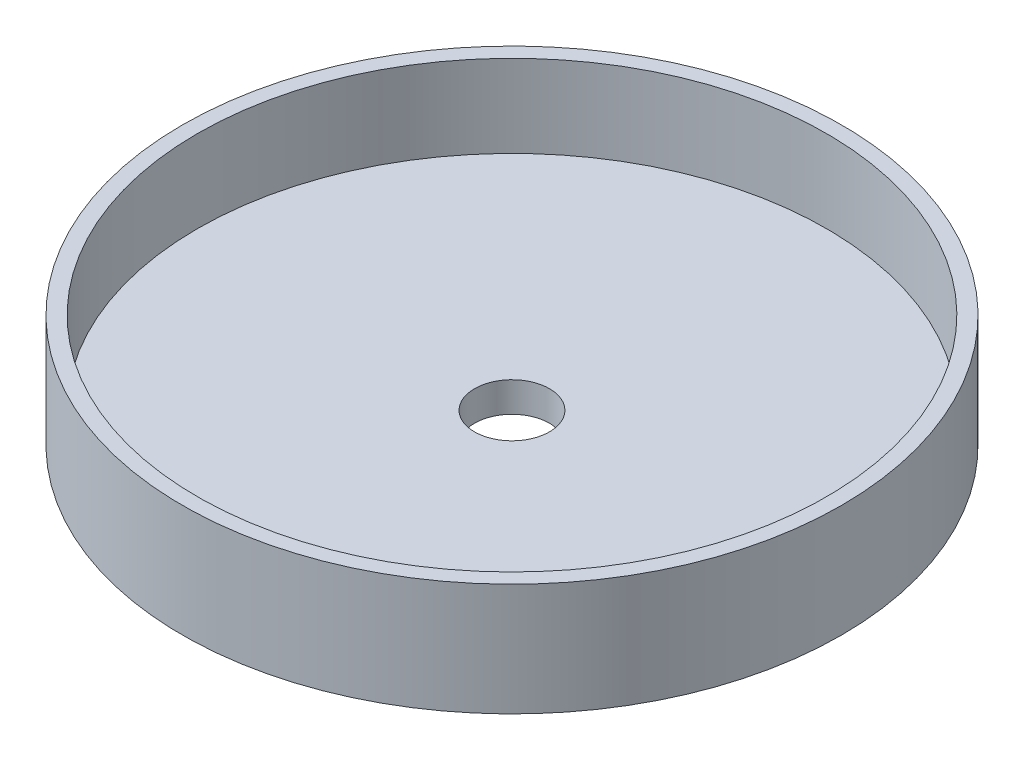
ISO-10303-21;
HEADER;
FILE_DESCRIPTION(('STEP AP214'),'2;1');
FILE_NAME('part.step','',(''),(''),'','','');
FILE_SCHEMA(('AUTOMOTIVE_DESIGN { 1 0 10303 214 1 1 1 1 }'));
ENDSEC;
DATA;
#1=APPLICATION_CONTEXT('core data for automotive mechanical design processes');
#2=APPLICATION_PROTOCOL_DEFINITION('international standard','automotive_design',2000,#1);
#3=PRODUCT_CONTEXT('',#1,'mechanical');
#4=PRODUCT('Part','Part','',(#3));
#5=PRODUCT_RELATED_PRODUCT_CATEGORY('part','',(#4));
#6=PRODUCT_DEFINITION_FORMATION('','',#4);
#7=PRODUCT_DEFINITION_CONTEXT('part definition',#1,'design');
#8=PRODUCT_DEFINITION('design','',#6,#7);
#9=PRODUCT_DEFINITION_SHAPE('','',#8);
#10=(LENGTH_UNIT() NAMED_UNIT(*) SI_UNIT(.MILLI.,.METRE.));
#11=(NAMED_UNIT(*) PLANE_ANGLE_UNIT() SI_UNIT($,.RADIAN.));
#12=(NAMED_UNIT(*) SI_UNIT($,.STERADIAN.) SOLID_ANGLE_UNIT());
#13=UNCERTAINTY_MEASURE_WITH_UNIT(LENGTH_MEASURE(1.E-05),#10,'distance_accuracy_value','');
#14=(GEOMETRIC_REPRESENTATION_CONTEXT(3) GLOBAL_UNCERTAINTY_ASSIGNED_CONTEXT((#13)) GLOBAL_UNIT_ASSIGNED_CONTEXT((#10,
#11,#12)) REPRESENTATION_CONTEXT('',''));
#15=CARTESIAN_POINT('',(0.,0.,0.));
#16=DIRECTION('',(0.,0.,1.));
#17=DIRECTION('',(1.,0.,0.));
#18=AXIS2_PLACEMENT_3D('',#15,#16,#17);
#19=CARTESIAN_POINT('',(0.,4.,0.));
#20=DIRECTION('',(0.,1.,0.));
#21=DIRECTION('',(-1.,0.,0.));
#22=AXIS2_PLACEMENT_3D('',#19,#20,#21);
#23=CYLINDRICAL_SURFACE('',#22,42.);
#24=CARTESIAN_POINT('',(0.,4.,0.));
#25=DIRECTION('',(0.,1.,0.));
#26=DIRECTION('',(-1.,0.,0.));
#27=AXIS2_PLACEMENT_3D('',#24,#25,#26);
#28=CIRCLE('',#27,42.);
#29=CARTESIAN_POINT('',(-42.,4.,0.));
#30=VERTEX_POINT('',#29);
#31=EDGE_CURVE('E10',#30,#30,#28,.T.);
#32=ORIENTED_EDGE('',*,*,#31,.F.);
#33=EDGE_LOOP('',(#32));
#34=FACE_BOUND('',#33,.T.);
#35=CARTESIAN_POINT('',(0.,15.,0.));
#36=DIRECTION('',(0.,1.,0.));
#37=DIRECTION('',(-1.,0.,0.));
#38=AXIS2_PLACEMENT_3D('',#35,#36,#37);
#39=CIRCLE('',#38,42.);
#40=CARTESIAN_POINT('',(-42.,15.,0.));
#41=VERTEX_POINT('',#40);
#42=EDGE_CURVE('E55',#41,#41,#39,.T.);
#43=ORIENTED_EDGE('',*,*,#42,.T.);
#44=EDGE_LOOP('',(#43));
#45=FACE_BOUND('',#44,.T.);
#46=ADVANCED_FACE('F33',(#34,#45),#23,.F.);
#47=CARTESIAN_POINT('',(0.,4.,0.));
#48=DIRECTION('',(0.,-1.,0.));
#49=DIRECTION('',(1.,0.,0.));
#50=AXIS2_PLACEMENT_3D('',#47,#48,#49);
#51=PLANE('',#50);
#52=CARTESIAN_POINT('',(0.,4.,0.));
#53=DIRECTION('',(0.,1.,0.));
#54=DIRECTION('',(-1.,0.,0.));
#55=AXIS2_PLACEMENT_3D('',#52,#53,#54);
#56=CIRCLE('',#55,5.);
#57=CARTESIAN_POINT('',(-5.,4.,0.));
#58=VERTEX_POINT('',#57);
#59=EDGE_CURVE('E39',#58,#58,#56,.T.);
#60=ORIENTED_EDGE('',*,*,#59,.F.);
#61=EDGE_LOOP('',(#60));
#62=FACE_BOUND('',#61,.T.);
#63=ORIENTED_EDGE('',*,*,#31,.T.);
#64=EDGE_LOOP('',(#63));
#65=FACE_BOUND('',#64,.T.);
#66=ADVANCED_FACE('F80',(#62,#65),#51,.F.);
#67=CARTESIAN_POINT('',(0.,4.,0.));
#68=DIRECTION('',(0.,1.,0.));
#69=DIRECTION('',(-1.,0.,0.));
#70=AXIS2_PLACEMENT_3D('',#67,#68,#69);
#71=CYLINDRICAL_SURFACE('',#70,5.);
#72=ORIENTED_EDGE('',*,*,#59,.T.);
#73=EDGE_LOOP('',(#72));
#74=FACE_BOUND('',#73,.T.);
#75=CARTESIAN_POINT('',(0.,0.,0.));
#76=DIRECTION('',(0.,1.,0.));
#77=DIRECTION('',(-1.,0.,0.));
#78=AXIS2_PLACEMENT_3D('',#75,#76,#77);
#79=CIRCLE('',#78,5.);
#80=CARTESIAN_POINT('',(-5.,0.,0.));
#81=VERTEX_POINT('',#80);
#82=EDGE_CURVE('E43',#81,#81,#79,.T.);
#83=ORIENTED_EDGE('',*,*,#82,.F.);
#84=EDGE_LOOP('',(#83));
#85=FACE_BOUND('',#84,.T.);
#86=ADVANCED_FACE('F75',(#74,#85),#71,.F.);
#87=CARTESIAN_POINT('',(0.,0.,0.));
#88=DIRECTION('',(0.,1.,0.));
#89=DIRECTION('',(-1.,0.,0.));
#90=AXIS2_PLACEMENT_3D('',#87,#88,#89);
#91=PLANE('',#90);
#92=CARTESIAN_POINT('',(0.,0.,0.));
#93=DIRECTION('',(0.,1.,0.));
#94=DIRECTION('',(-1.,0.,0.));
#95=AXIS2_PLACEMENT_3D('',#92,#93,#94);
#96=CIRCLE('',#95,44.);
#97=CARTESIAN_POINT('',(-44.,0.,0.));
#98=VERTEX_POINT('',#97);
#99=EDGE_CURVE('E47',#98,#98,#96,.T.);
#100=ORIENTED_EDGE('',*,*,#99,.F.);
#101=EDGE_LOOP('',(#100));
#102=FACE_BOUND('',#101,.T.);
#103=ORIENTED_EDGE('',*,*,#82,.T.);
#104=EDGE_LOOP('',(#103));
#105=FACE_BOUND('',#104,.T.);
#106=ADVANCED_FACE('F69',(#102,#105),#91,.F.);
#107=CARTESIAN_POINT('',(0.,4.,0.));
#108=DIRECTION('',(0.,1.,0.));
#109=DIRECTION('',(-1.,0.,0.));
#110=AXIS2_PLACEMENT_3D('',#107,#108,#109);
#111=CYLINDRICAL_SURFACE('',#110,44.);
#112=CARTESIAN_POINT('',(0.,15.,0.));
#113=DIRECTION('',(0.,1.,0.));
#114=DIRECTION('',(-1.,0.,0.));
#115=AXIS2_PLACEMENT_3D('',#112,#113,#114);
#116=CIRCLE('',#115,44.);
#117=CARTESIAN_POINT('',(-44.,15.,0.));
#118=VERTEX_POINT('',#117);
#119=EDGE_CURVE('E52',#118,#118,#116,.T.);
#120=ORIENTED_EDGE('',*,*,#119,.F.);
#121=EDGE_LOOP('',(#120));
#122=FACE_BOUND('',#121,.T.);
#123=ORIENTED_EDGE('',*,*,#99,.T.);
#124=EDGE_LOOP('',(#123));
#125=FACE_BOUND('',#124,.T.);
#126=ADVANCED_FACE('F63',(#122,#125),#111,.T.);
#127=CARTESIAN_POINT('',(0.,15.,0.));
#128=DIRECTION('',(0.,-1.,0.));
#129=DIRECTION('',(1.,0.,0.));
#130=AXIS2_PLACEMENT_3D('',#127,#128,#129);
#131=PLANE('',#130);
#132=ORIENTED_EDGE('',*,*,#42,.F.);
#133=EDGE_LOOP('',(#132));
#134=FACE_BOUND('',#133,.T.);
#135=ORIENTED_EDGE('',*,*,#119,.T.);
#136=EDGE_LOOP('',(#135));
#137=FACE_BOUND('',#136,.T.);
#138=ADVANCED_FACE('F60',(#134,#137),#131,.F.);
#139=CLOSED_SHELL('',(#46,#66,#86,#106,#126,#138));
#140=MANIFOLD_SOLID_BREP('B2',#139);
#141=ADVANCED_BREP_SHAPE_REPRESENTATION('',(#18,#140),#14);
#142=SHAPE_DEFINITION_REPRESENTATION(#9,#141);
ENDSEC;
END-ISO-10303-21;
